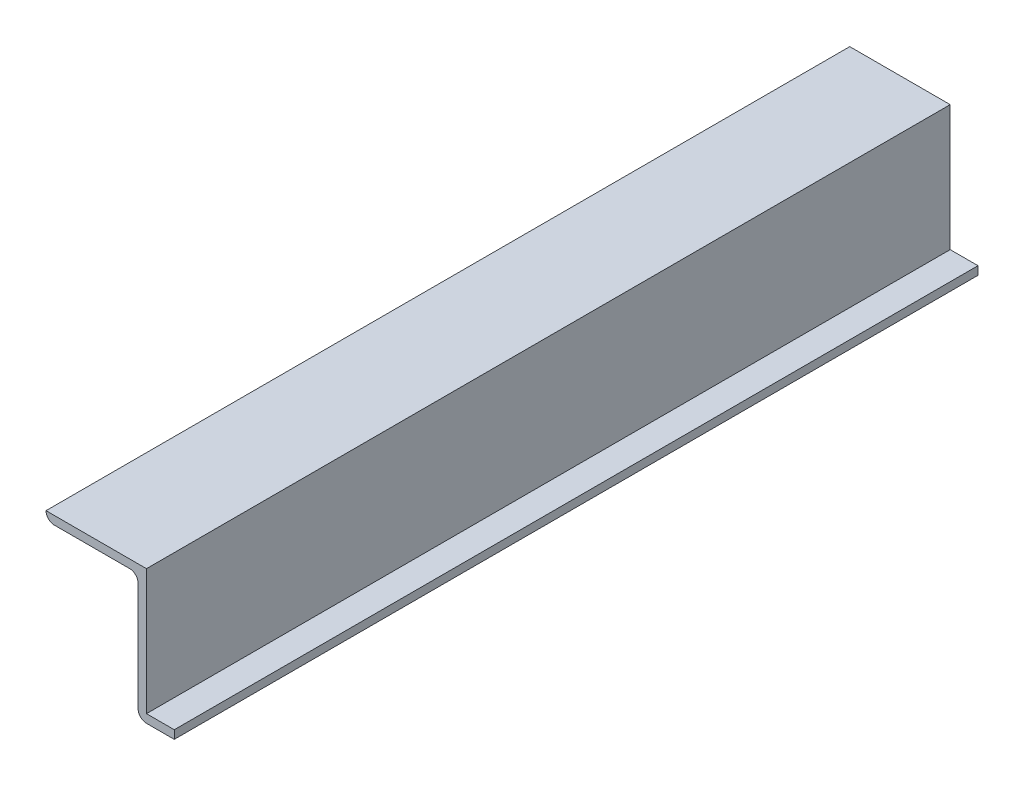
ISO-10303-21;
HEADER;
FILE_DESCRIPTION(('STEP AP214'),'2;1');
FILE_NAME('part.step','',(''),(''),'','','');
FILE_SCHEMA(('AUTOMOTIVE_DESIGN { 1 0 10303 214 1 1 1 1 }'));
ENDSEC;
DATA;
#1=APPLICATION_CONTEXT('core data for automotive mechanical design processes');
#2=APPLICATION_PROTOCOL_DEFINITION('international standard','automotive_design',2000,#1);
#3=PRODUCT_CONTEXT('',#1,'mechanical');
#4=PRODUCT('Part','Part','',(#3));
#5=PRODUCT_RELATED_PRODUCT_CATEGORY('part','',(#4));
#6=PRODUCT_DEFINITION_FORMATION('','',#4);
#7=PRODUCT_DEFINITION_CONTEXT('part definition',#1,'design');
#8=PRODUCT_DEFINITION('design','',#6,#7);
#9=PRODUCT_DEFINITION_SHAPE('','',#8);
#10=(LENGTH_UNIT() NAMED_UNIT(*) SI_UNIT(.MILLI.,.METRE.));
#11=(NAMED_UNIT(*) PLANE_ANGLE_UNIT() SI_UNIT($,.RADIAN.));
#12=(NAMED_UNIT(*) SI_UNIT($,.STERADIAN.) SOLID_ANGLE_UNIT());
#13=UNCERTAINTY_MEASURE_WITH_UNIT(LENGTH_MEASURE(1.E-05),#10,'distance_accuracy_value','');
#14=(GEOMETRIC_REPRESENTATION_CONTEXT(3) GLOBAL_UNCERTAINTY_ASSIGNED_CONTEXT((#13)) GLOBAL_UNIT_ASSIGNED_CONTEXT((#10,
#11,#12)) REPRESENTATION_CONTEXT('',''));
#15=CARTESIAN_POINT('',(0.,0.,0.));
#16=DIRECTION('',(0.,0.,1.));
#17=DIRECTION('',(1.,0.,0.));
#18=AXIS2_PLACEMENT_3D('',#15,#16,#17);
#19=CARTESIAN_POINT('',(0.,47.625,152.4));
#20=DIRECTION('',(0.,1.,0.));
#21=DIRECTION('',(-1.,0.,0.));
#22=AXIS2_PLACEMENT_3D('',#19,#20,#21);
#23=PLANE('',#22);
#24=DIRECTION('',(1.,0.,0.));
#25=VECTOR('',#24,1.);
#26=CARTESIAN_POINT('',(0.,47.625,152.4));
#27=LINE('',#26,#25);
#28=CARTESIAN_POINT('',(-31.75,47.625,152.4));
#29=VERTEX_POINT('',#28);
#30=CARTESIAN_POINT('',(-3.175,47.625,152.4));
#31=VERTEX_POINT('',#30);
#32=EDGE_CURVE('E164',#29,#31,#27,.T.);
#33=ORIENTED_EDGE('',*,*,#32,.F.);
#34=DIRECTION('',(0.,0.,-1.));
#35=VECTOR('',#34,1.);
#36=CARTESIAN_POINT('',(-31.75,47.625,152.4));
#37=LINE('',#36,#35);
#38=CARTESIAN_POINT('',(-31.75,47.625,-152.4));
#39=VERTEX_POINT('',#38);
#40=EDGE_CURVE('E187',#29,#39,#37,.T.);
#41=ORIENTED_EDGE('',*,*,#40,.T.);
#42=DIRECTION('',(1.,0.,0.));
#43=VECTOR('',#42,1.);
#44=CARTESIAN_POINT('',(0.,47.625,-152.4));
#45=LINE('',#44,#43);
#46=CARTESIAN_POINT('',(-3.175,47.625,-152.4));
#47=VERTEX_POINT('',#46);
#48=EDGE_CURVE('E149',#39,#47,#45,.T.);
#49=ORIENTED_EDGE('',*,*,#48,.T.);
#50=DIRECTION('',(0.,0.,-1.));
#51=VECTOR('',#50,1.);
#52=CARTESIAN_POINT('',(-3.175,47.625,152.4));
#53=LINE('',#52,#51);
#54=EDGE_CURVE('E52',#47,#31,#53,.F.);
#55=ORIENTED_EDGE('',*,*,#54,.T.);
#56=EDGE_LOOP('',(#33,#41,#49,#55));
#57=FACE_BOUND('',#56,.T.);
#58=ADVANCED_FACE('F37',(#57),#23,.F.);
#59=CARTESIAN_POINT('',(0.,0.,152.4));
#60=DIRECTION('',(1.,0.,0.));
#61=DIRECTION('',(0.,0.,-1.));
#62=AXIS2_PLACEMENT_3D('',#59,#60,#61);
#63=PLANE('',#62);
#64=DIRECTION('',(0.,-1.,0.));
#65=VECTOR('',#64,1.);
#66=CARTESIAN_POINT('',(0.,0.,-152.4));
#67=LINE('',#66,#65);
#68=CARTESIAN_POINT('',(0.,44.45,-152.4));
#69=VERTEX_POINT('',#68);
#70=CARTESIAN_POINT('',(0.,3.175,-152.4));
#71=VERTEX_POINT('',#70);
#72=EDGE_CURVE('E151',#69,#71,#67,.T.);
#73=ORIENTED_EDGE('',*,*,#72,.T.);
#74=DIRECTION('',(0.,0.,-1.));
#75=VECTOR('',#74,1.);
#76=CARTESIAN_POINT('',(0.,3.175,152.4));
#77=LINE('',#76,#75);
#78=CARTESIAN_POINT('',(0.,3.175,152.4));
#79=VERTEX_POINT('',#78);
#80=EDGE_CURVE('E182',#71,#79,#77,.F.);
#81=ORIENTED_EDGE('',*,*,#80,.T.);
#82=DIRECTION('',(0.,-1.,0.));
#83=VECTOR('',#82,1.);
#84=CARTESIAN_POINT('',(0.,0.,152.4));
#85=LINE('',#84,#83);
#86=CARTESIAN_POINT('',(0.,44.45,152.4));
#87=VERTEX_POINT('',#86);
#88=EDGE_CURVE('E124',#87,#79,#85,.T.);
#89=ORIENTED_EDGE('',*,*,#88,.F.);
#90=DIRECTION('',(0.,0.,-1.));
#91=VECTOR('',#90,1.);
#92=CARTESIAN_POINT('',(0.,44.45,-152.4));
#93=LINE('',#92,#91);
#94=EDGE_CURVE('E179',#87,#69,#93,.T.);
#95=ORIENTED_EDGE('',*,*,#94,.T.);
#96=EDGE_LOOP('',(#73,#81,#89,#95));
#97=FACE_BOUND('',#96,.T.);
#98=ADVANCED_FACE('F199',(#97),#63,.F.);
#99=CARTESIAN_POINT('',(0.,0.,152.4));
#100=DIRECTION('',(0.,1.,0.));
#101=DIRECTION('',(0.,0.,1.));
#102=AXIS2_PLACEMENT_3D('',#99,#100,#101);
#103=PLANE('',#102);
#104=DIRECTION('',(1.,0.,0.));
#105=VECTOR('',#104,1.);
#106=CARTESIAN_POINT('',(0.,0.,152.4));
#107=LINE('',#106,#105);
#108=CARTESIAN_POINT('',(3.175,0.,152.4));
#109=VERTEX_POINT('',#108);
#110=CARTESIAN_POINT('',(13.716,0.,152.4));
#111=VERTEX_POINT('',#110);
#112=EDGE_CURVE('E112',#109,#111,#107,.T.);
#113=ORIENTED_EDGE('',*,*,#112,.F.);
#114=DIRECTION('',(0.,0.,-1.));
#115=VECTOR('',#114,1.);
#116=CARTESIAN_POINT('',(3.175,0.,152.4));
#117=LINE('',#116,#115);
#118=CARTESIAN_POINT('',(3.175,0.,-152.4));
#119=VERTEX_POINT('',#118);
#120=EDGE_CURVE('E133',#109,#119,#117,.T.);
#121=ORIENTED_EDGE('',*,*,#120,.T.);
#122=DIRECTION('',(1.,0.,0.));
#123=VECTOR('',#122,1.);
#124=CARTESIAN_POINT('',(0.,0.,-152.4));
#125=LINE('',#124,#123);
#126=CARTESIAN_POINT('',(13.716,0.,-152.4));
#127=VERTEX_POINT('',#126);
#128=EDGE_CURVE('E130',#119,#127,#125,.T.);
#129=ORIENTED_EDGE('',*,*,#128,.T.);
#130=DIRECTION('',(0.,0.,-1.));
#131=VECTOR('',#130,1.);
#132=CARTESIAN_POINT('',(13.716,0.,152.4));
#133=LINE('',#132,#131);
#134=EDGE_CURVE('E127',#111,#127,#133,.T.);
#135=ORIENTED_EDGE('',*,*,#134,.F.);
#136=EDGE_LOOP('',(#113,#121,#129,#135));
#137=FACE_BOUND('',#136,.T.);
#138=ADVANCED_FACE('F128',(#137),#103,.F.);
#139=CARTESIAN_POINT('',(13.716,0.,152.4));
#140=DIRECTION('',(-1.,0.,0.));
#141=DIRECTION('',(0.,0.,1.));
#142=AXIS2_PLACEMENT_3D('',#139,#140,#141);
#143=PLANE('',#142);
#144=DIRECTION('',(0.,1.,0.));
#145=VECTOR('',#144,1.);
#146=CARTESIAN_POINT('',(13.716,0.,-152.4));
#147=LINE('',#146,#145);
#148=CARTESIAN_POINT('',(13.716,3.175,-152.4));
#149=VERTEX_POINT('',#148);
#150=EDGE_CURVE('E155',#127,#149,#147,.T.);
#151=ORIENTED_EDGE('',*,*,#150,.T.);
#152=DIRECTION('',(0.,0.,-1.));
#153=VECTOR('',#152,1.);
#154=CARTESIAN_POINT('',(13.716,3.175,152.4));
#155=LINE('',#154,#153);
#156=CARTESIAN_POINT('',(13.716,3.175,152.4));
#157=VERTEX_POINT('',#156);
#158=EDGE_CURVE('E134',#157,#149,#155,.T.);
#159=ORIENTED_EDGE('',*,*,#158,.F.);
#160=DIRECTION('',(0.,1.,0.));
#161=VECTOR('',#160,1.);
#162=CARTESIAN_POINT('',(13.716,0.,152.4));
#163=LINE('',#162,#161);
#164=EDGE_CURVE('E117',#111,#157,#163,.T.);
#165=ORIENTED_EDGE('',*,*,#164,.F.);
#166=ORIENTED_EDGE('',*,*,#134,.T.);
#167=EDGE_LOOP('',(#151,#159,#165,#166));
#168=FACE_BOUND('',#167,.T.);
#169=ADVANCED_FACE('F136',(#168),#143,.F.);
#170=CARTESIAN_POINT('',(3.175,3.175,152.4));
#171=DIRECTION('',(0.,-1.,0.));
#172=DIRECTION('',(0.,0.,-1.));
#173=AXIS2_PLACEMENT_3D('',#170,#171,#172);
#174=PLANE('',#173);
#175=DIRECTION('',(-1.,0.,0.));
#176=VECTOR('',#175,1.);
#177=CARTESIAN_POINT('',(3.175,3.175,-152.4));
#178=LINE('',#177,#176);
#179=CARTESIAN_POINT('',(3.175,3.175,-152.4));
#180=VERTEX_POINT('',#179);
#181=EDGE_CURVE('E157',#149,#180,#178,.T.);
#182=ORIENTED_EDGE('',*,*,#181,.T.);
#183=DIRECTION('',(0.,0.,-1.));
#184=VECTOR('',#183,1.);
#185=CARTESIAN_POINT('',(3.175,3.175,152.4));
#186=LINE('',#185,#184);
#187=CARTESIAN_POINT('',(3.175,3.175,152.4));
#188=VERTEX_POINT('',#187);
#189=EDGE_CURVE('E170',#188,#180,#186,.T.);
#190=ORIENTED_EDGE('',*,*,#189,.F.);
#191=DIRECTION('',(-1.,0.,0.));
#192=VECTOR('',#191,1.);
#193=CARTESIAN_POINT('',(3.175,3.175,152.4));
#194=LINE('',#193,#192);
#195=EDGE_CURVE('E139',#157,#188,#194,.T.);
#196=ORIENTED_EDGE('',*,*,#195,.F.);
#197=ORIENTED_EDGE('',*,*,#158,.T.);
#198=EDGE_LOOP('',(#182,#190,#196,#197));
#199=FACE_BOUND('',#198,.T.);
#200=ADVANCED_FACE('F207',(#199),#174,.F.);
#201=CARTESIAN_POINT('',(3.175,50.8,152.4));
#202=DIRECTION('',(-1.,0.,0.));
#203=DIRECTION('',(0.,-1.,0.));
#204=AXIS2_PLACEMENT_3D('',#201,#202,#203);
#205=PLANE('',#204);
#206=DIRECTION('',(0.,1.,0.));
#207=VECTOR('',#206,1.);
#208=CARTESIAN_POINT('',(3.175,50.8,-152.4));
#209=LINE('',#208,#207);
#210=CARTESIAN_POINT('',(3.175,50.8,-152.4));
#211=VERTEX_POINT('',#210);
#212=EDGE_CURVE('E159',#180,#211,#209,.T.);
#213=ORIENTED_EDGE('',*,*,#212,.T.);
#214=DIRECTION('',(0.,0.,-1.));
#215=VECTOR('',#214,1.);
#216=CARTESIAN_POINT('',(3.175,50.8,152.4));
#217=LINE('',#216,#215);
#218=CARTESIAN_POINT('',(3.175,50.8,152.4));
#219=VERTEX_POINT('',#218);
#220=EDGE_CURVE('E167',#219,#211,#217,.T.);
#221=ORIENTED_EDGE('',*,*,#220,.F.);
#222=DIRECTION('',(0.,1.,0.));
#223=VECTOR('',#222,1.);
#224=CARTESIAN_POINT('',(3.175,50.8,152.4));
#225=LINE('',#224,#223);
#226=EDGE_CURVE('E141',#188,#219,#225,.T.);
#227=ORIENTED_EDGE('',*,*,#226,.F.);
#228=ORIENTED_EDGE('',*,*,#189,.T.);
#229=EDGE_LOOP('',(#213,#221,#227,#228));
#230=FACE_BOUND('',#229,.T.);
#231=ADVANCED_FACE('F214',(#230),#205,.F.);
#232=CARTESIAN_POINT('',(-34.925,50.8,152.4));
#233=DIRECTION('',(0.,-1.,0.));
#234=DIRECTION('',(0.,0.,-1.));
#235=AXIS2_PLACEMENT_3D('',#232,#233,#234);
#236=PLANE('',#235);
#237=DIRECTION('',(-1.,0.,0.));
#238=VECTOR('',#237,1.);
#239=CARTESIAN_POINT('',(-34.925,50.8,-152.4));
#240=LINE('',#239,#238);
#241=CARTESIAN_POINT('',(-34.925,50.8,-152.4));
#242=VERTEX_POINT('',#241);
#243=EDGE_CURVE('E161',#211,#242,#240,.T.);
#244=ORIENTED_EDGE('',*,*,#243,.T.);
#245=DIRECTION('',(0.,0.,-1.));
#246=VECTOR('',#245,1.);
#247=CARTESIAN_POINT('',(-34.925,50.8,152.4));
#248=LINE('',#247,#246);
#249=CARTESIAN_POINT('',(-34.925,50.8,152.4));
#250=VERTEX_POINT('',#249);
#251=EDGE_CURVE('E148',#250,#242,#248,.T.);
#252=ORIENTED_EDGE('',*,*,#251,.F.);
#253=DIRECTION('',(-1.,0.,0.));
#254=VECTOR('',#253,1.);
#255=CARTESIAN_POINT('',(-34.925,50.8,152.4));
#256=LINE('',#255,#254);
#257=EDGE_CURVE('E146',#219,#250,#256,.T.);
#258=ORIENTED_EDGE('',*,*,#257,.F.);
#259=ORIENTED_EDGE('',*,*,#220,.T.);
#260=EDGE_LOOP('',(#244,#252,#258,#259));
#261=FACE_BOUND('',#260,.T.);
#262=ADVANCED_FACE('F217',(#261),#236,.F.);
#263=CARTESIAN_POINT('',(0.,0.,152.4));
#264=DIRECTION('',(0.,0.,-1.));
#265=DIRECTION('',(-1.,0.,0.));
#266=AXIS2_PLACEMENT_3D('',#263,#264,#265);
#267=PLANE('',#266);
#268=ORIENTED_EDGE('',*,*,#88,.T.);
#269=CARTESIAN_POINT('',(3.175,3.175,152.4));
#270=DIRECTION('',(0.,0.,-1.));
#271=DIRECTION('',(-1.,0.,0.));
#272=AXIS2_PLACEMENT_3D('',#269,#270,#271);
#273=CIRCLE('',#272,3.175);
#274=EDGE_CURVE('E120',#79,#109,#273,.F.);
#275=ORIENTED_EDGE('',*,*,#274,.T.);
#276=ORIENTED_EDGE('',*,*,#112,.T.);
#277=ORIENTED_EDGE('',*,*,#164,.T.);
#278=ORIENTED_EDGE('',*,*,#195,.T.);
#279=ORIENTED_EDGE('',*,*,#226,.T.);
#280=ORIENTED_EDGE('',*,*,#257,.T.);
#281=CARTESIAN_POINT('',(-31.75,50.8,152.4));
#282=DIRECTION('',(0.,0.,-1.));
#283=DIRECTION('',(-1.,0.,0.));
#284=AXIS2_PLACEMENT_3D('',#281,#282,#283);
#285=CIRCLE('',#284,3.175);
#286=EDGE_CURVE('E59',#250,#29,#285,.F.);
#287=ORIENTED_EDGE('',*,*,#286,.T.);
#288=ORIENTED_EDGE('',*,*,#32,.T.);
#289=CARTESIAN_POINT('',(-3.175,44.45,152.4));
#290=DIRECTION('',(0.,0.,-1.));
#291=DIRECTION('',(-1.,0.,0.));
#292=AXIS2_PLACEMENT_3D('',#289,#290,#291);
#293=CIRCLE('',#292,3.175);
#294=EDGE_CURVE('E11',#31,#87,#293,.T.);
#295=ORIENTED_EDGE('',*,*,#294,.T.);
#296=EDGE_LOOP('',(#268,#275,#276,#277,#278,#279,#280,#287,#288,#295));
#297=FACE_BOUND('',#296,.T.);
#298=ADVANCED_FACE('F115',(#297),#267,.F.);
#299=CARTESIAN_POINT('',(0.,0.,-152.4));
#300=DIRECTION('',(0.,0.,-1.));
#301=DIRECTION('',(-1.,0.,0.));
#302=AXIS2_PLACEMENT_3D('',#299,#300,#301);
#303=PLANE('',#302);
#304=ORIENTED_EDGE('',*,*,#128,.F.);
#305=CARTESIAN_POINT('',(3.175,3.175,-152.4));
#306=DIRECTION('',(0.,0.,-1.));
#307=DIRECTION('',(-1.,0.,0.));
#308=AXIS2_PLACEMENT_3D('',#305,#306,#307);
#309=CIRCLE('',#308,3.175);
#310=EDGE_CURVE('E177',#119,#71,#309,.T.);
#311=ORIENTED_EDGE('',*,*,#310,.T.);
#312=ORIENTED_EDGE('',*,*,#72,.F.);
#313=CARTESIAN_POINT('',(-3.175,44.45,-152.4));
#314=DIRECTION('',(0.,0.,-1.));
#315=DIRECTION('',(-1.,0.,0.));
#316=AXIS2_PLACEMENT_3D('',#313,#314,#315);
#317=CIRCLE('',#316,3.175);
#318=EDGE_CURVE('E45',#69,#47,#317,.F.);
#319=ORIENTED_EDGE('',*,*,#318,.T.);
#320=ORIENTED_EDGE('',*,*,#48,.F.);
#321=CARTESIAN_POINT('',(-31.75,50.8,-152.4));
#322=DIRECTION('',(0.,0.,-1.));
#323=DIRECTION('',(-1.,0.,0.));
#324=AXIS2_PLACEMENT_3D('',#321,#322,#323);
#325=CIRCLE('',#324,3.175);
#326=EDGE_CURVE('E175',#39,#242,#325,.T.);
#327=ORIENTED_EDGE('',*,*,#326,.T.);
#328=ORIENTED_EDGE('',*,*,#243,.F.);
#329=ORIENTED_EDGE('',*,*,#212,.F.);
#330=ORIENTED_EDGE('',*,*,#181,.F.);
#331=ORIENTED_EDGE('',*,*,#150,.F.);
#332=EDGE_LOOP('',(#304,#311,#312,#319,#320,#327,#328,#329,#330,#331));
#333=FACE_BOUND('',#332,.T.);
#334=ADVANCED_FACE('F192',(#333),#303,.T.);
#335=CARTESIAN_POINT('',(3.175,3.175,152.4));
#336=DIRECTION('',(0.,0.,-1.));
#337=DIRECTION('',(-1.,0.,0.));
#338=AXIS2_PLACEMENT_3D('',#335,#336,#337);
#339=CYLINDRICAL_SURFACE('',#338,3.175);
#340=ORIENTED_EDGE('',*,*,#274,.F.);
#341=ORIENTED_EDGE('',*,*,#80,.F.);
#342=ORIENTED_EDGE('',*,*,#310,.F.);
#343=ORIENTED_EDGE('',*,*,#120,.F.);
#344=EDGE_LOOP('',(#340,#341,#342,#343));
#345=FACE_BOUND('',#344,.T.);
#346=ADVANCED_FACE('F203',(#345),#339,.T.);
#347=CARTESIAN_POINT('',(-31.75,50.8,152.4));
#348=DIRECTION('',(0.,0.,-1.));
#349=DIRECTION('',(-1.,0.,0.));
#350=AXIS2_PLACEMENT_3D('',#347,#348,#349);
#351=CYLINDRICAL_SURFACE('',#350,3.175);
#352=ORIENTED_EDGE('',*,*,#286,.F.);
#353=ORIENTED_EDGE('',*,*,#251,.T.);
#354=ORIENTED_EDGE('',*,*,#326,.F.);
#355=ORIENTED_EDGE('',*,*,#40,.F.);
#356=EDGE_LOOP('',(#352,#353,#354,#355));
#357=FACE_BOUND('',#356,.T.);
#358=ADVANCED_FACE('F219',(#357),#351,.T.);
#359=CARTESIAN_POINT('',(-3.175,44.45,152.4));
#360=DIRECTION('',(0.,0.,1.));
#361=DIRECTION('',(1.,0.,0.));
#362=AXIS2_PLACEMENT_3D('',#359,#360,#361);
#363=CYLINDRICAL_SURFACE('',#362,3.175);
#364=ORIENTED_EDGE('',*,*,#294,.F.);
#365=ORIENTED_EDGE('',*,*,#54,.F.);
#366=ORIENTED_EDGE('',*,*,#318,.F.);
#367=ORIENTED_EDGE('',*,*,#94,.F.);
#368=EDGE_LOOP('',(#364,#365,#366,#367));
#369=FACE_BOUND('',#368,.T.);
#370=ADVANCED_FACE('F39',(#369),#363,.F.);
#371=CLOSED_SHELL('',(#58,#98,#138,#169,#200,#231,#262,#298,#334,#346,#358,#370));
#372=MANIFOLD_SOLID_BREP('B2',#371);
#373=ADVANCED_BREP_SHAPE_REPRESENTATION('',(#18,#372),#14);
#374=SHAPE_DEFINITION_REPRESENTATION(#9,#373);
ENDSEC;
END-ISO-10303-21;
